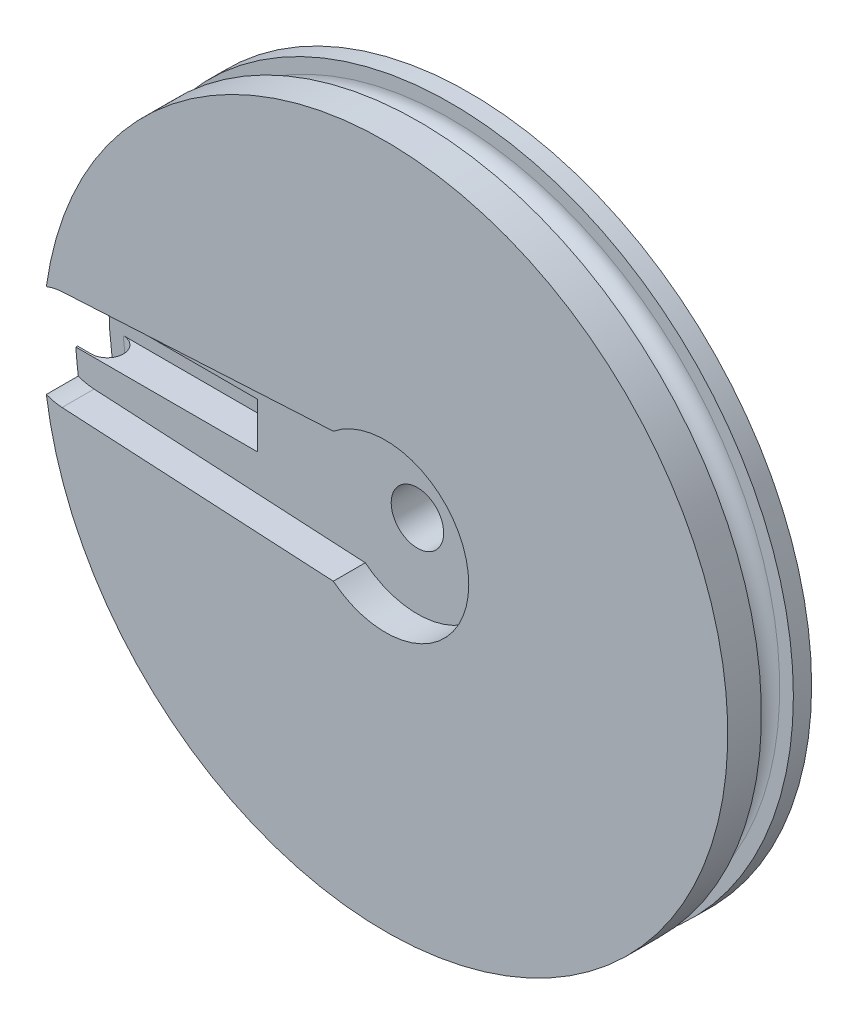
ISO-10303-21;
HEADER;
FILE_DESCRIPTION(('STEP AP214'),'2;1');
FILE_NAME('part.step','',(''),(''),'','','');
FILE_SCHEMA(('AUTOMOTIVE_DESIGN { 1 0 10303 214 1 1 1 1 }'));
ENDSEC;
DATA;
#1=APPLICATION_CONTEXT('core data for automotive mechanical design processes');
#2=APPLICATION_PROTOCOL_DEFINITION('international standard','automotive_design',2000,#1);
#3=PRODUCT_CONTEXT('',#1,'mechanical');
#4=PRODUCT('Part','Part','',(#3));
#5=PRODUCT_RELATED_PRODUCT_CATEGORY('part','',(#4));
#6=PRODUCT_DEFINITION_FORMATION('','',#4);
#7=PRODUCT_DEFINITION_CONTEXT('part definition',#1,'design');
#8=PRODUCT_DEFINITION('design','',#6,#7);
#9=PRODUCT_DEFINITION_SHAPE('','',#8);
#10=(LENGTH_UNIT() NAMED_UNIT(*) SI_UNIT(.MILLI.,.METRE.));
#11=(NAMED_UNIT(*) PLANE_ANGLE_UNIT() SI_UNIT($,.RADIAN.));
#12=(NAMED_UNIT(*) SI_UNIT($,.STERADIAN.) SOLID_ANGLE_UNIT());
#13=UNCERTAINTY_MEASURE_WITH_UNIT(LENGTH_MEASURE(1.E-05),#10,'distance_accuracy_value','');
#14=(GEOMETRIC_REPRESENTATION_CONTEXT(3) GLOBAL_UNCERTAINTY_ASSIGNED_CONTEXT((#13)) GLOBAL_UNIT_ASSIGNED_CONTEXT((#10,
#11,#12)) REPRESENTATION_CONTEXT('',''));
#15=CARTESIAN_POINT('',(0.,0.,0.));
#16=DIRECTION('',(0.,0.,1.));
#17=DIRECTION('',(1.,0.,0.));
#18=AXIS2_PLACEMENT_3D('',#15,#16,#17);
#19=CARTESIAN_POINT('',(0.,0.,1.8375));
#20=DIRECTION('',(0.,0.,-1.));
#21=DIRECTION('',(-1.,0.,0.));
#22=AXIS2_PLACEMENT_3D('',#19,#20,#21);
#23=PLANE('',#22);
#24=DIRECTION('',(0.998510440144325,-0.0545609835210725,0.));
#25=VECTOR('',#24,1.);
#26=CARTESIAN_POINT('',(-14.1700341637464,-2.19672296831752,1.8375));
#27=LINE('',#26,#25);
#28=CARTESIAN_POINT('',(-14.1700341637464,-2.19672296831752,1.8375));
#29=VERTEX_POINT('',#28);
#30=CARTESIAN_POINT('',(-2.28516626205192,-2.84614039618211,1.8375));
#31=VERTEX_POINT('',#30);
#32=EDGE_CURVE('E212',#29,#31,#27,.T.);
#33=ORIENTED_EDGE('',*,*,#32,.F.);
#34=CARTESIAN_POINT('',(-14.05,0.,1.8375));
#35=DIRECTION('',(0.,0.,1.));
#36=DIRECTION('',(1.,0.,0.));
#37=AXIS2_PLACEMENT_3D('',#34,#35,#36);
#38=CIRCLE('',#37,2.2);
#39=CARTESIAN_POINT('',(-14.8598754448399,-2.04550770319876,1.8375));
#40=VERTEX_POINT('',#39);
#41=EDGE_CURVE('E231',#40,#29,#38,.T.);
#42=ORIENTED_EDGE('',*,*,#41,.F.);
#43=CARTESIAN_POINT('',(0.,0.,1.8375));
#44=DIRECTION('',(0.,0.,1.));
#45=DIRECTION('',(1.,0.,0.));
#46=AXIS2_PLACEMENT_3D('',#43,#44,#45);
#47=CIRCLE('',#46,15.);
#48=CARTESIAN_POINT('',(-14.8598754448399,2.04550770319875,1.8375));
#49=VERTEX_POINT('',#48);
#50=EDGE_CURVE('E241',#40,#49,#47,.T.);
#51=ORIENTED_EDGE('',*,*,#50,.T.);
#52=CARTESIAN_POINT('',(-14.1700341637464,2.19672296831751,1.8375));
#53=VERTEX_POINT('',#52);
#54=EDGE_CURVE('E232',#53,#49,#38,.T.);
#55=ORIENTED_EDGE('',*,*,#54,.F.);
#56=DIRECTION('',(-0.998510440144325,-0.0545609835210729,0.));
#57=VECTOR('',#56,1.);
#58=CARTESIAN_POINT('',(-2.28516626205191,2.84614039618211,1.8375));
#59=LINE('',#58,#57);
#60=CARTESIAN_POINT('',(-2.28516626205191,2.84614039618211,1.8375));
#61=VERTEX_POINT('',#60);
#62=EDGE_CURVE('E227',#61,#53,#59,.T.);
#63=ORIENTED_EDGE('',*,*,#62,.F.);
#64=CARTESIAN_POINT('',(0.,0.,1.8375));
#65=DIRECTION('',(0.,0.,1.));
#66=DIRECTION('',(1.,0.,0.));
#67=AXIS2_PLACEMENT_3D('',#64,#65,#66);
#68=CIRCLE('',#67,3.65);
#69=EDGE_CURVE('E223',#31,#61,#68,.T.);
#70=ORIENTED_EDGE('',*,*,#69,.F.);
#71=EDGE_LOOP('',(#33,#42,#51,#55,#63,#70));
#72=FACE_BOUND('',#71,.T.);
#73=ADVANCED_FACE('F45',(#72),#23,.F.);
#74=CARTESIAN_POINT('',(0.,0.,-1.8375));
#75=DIRECTION('',(0.,0.,1.));
#76=DIRECTION('',(1.,0.,0.));
#77=AXIS2_PLACEMENT_3D('',#74,#75,#76);
#78=PLANE('',#77);
#79=CARTESIAN_POINT('',(0.,0.,-1.8375));
#80=DIRECTION('',(0.,0.,-1.));
#81=DIRECTION('',(-1.,0.,0.));
#82=AXIS2_PLACEMENT_3D('',#79,#80,#81);
#83=CIRCLE('',#82,1.15);
#84=CARTESIAN_POINT('',(-1.15,0.,-1.8375));
#85=VERTEX_POINT('',#84);
#86=EDGE_CURVE('E203',#85,#85,#83,.T.);
#87=ORIENTED_EDGE('',*,*,#86,.F.);
#88=EDGE_LOOP('',(#87));
#89=FACE_BOUND('',#88,.T.);
#90=CARTESIAN_POINT('',(0.,0.,-1.8375));
#91=DIRECTION('',(0.,0.,1.));
#92=DIRECTION('',(1.,0.,0.));
#93=AXIS2_PLACEMENT_3D('',#90,#91,#92);
#94=CIRCLE('',#93,15.);
#95=CARTESIAN_POINT('',(15.,0.,-1.8375));
#96=VERTEX_POINT('',#95);
#97=EDGE_CURVE('E268',#96,#96,#94,.T.);
#98=ORIENTED_EDGE('',*,*,#97,.F.);
#99=EDGE_LOOP('',(#98));
#100=FACE_BOUND('',#99,.T.);
#101=ADVANCED_FACE('F339',(#89,#100),#78,.F.);
#102=CARTESIAN_POINT('',(0.,0.,1.8375));
#103=DIRECTION('',(0.,0.,1.));
#104=DIRECTION('',(1.,0.,0.));
#105=AXIS2_PLACEMENT_3D('',#102,#103,#104);
#106=CYLINDRICAL_SURFACE('',#105,15.);
#107=CARTESIAN_POINT('',(0.,0.,-1.0375));
#108=DIRECTION('',(0.,0.,1.));
#109=DIRECTION('',(1.,0.,0.));
#110=AXIS2_PLACEMENT_3D('',#107,#108,#109);
#111=CIRCLE('',#110,15.);
#112=CARTESIAN_POINT('',(15.,0.,-1.0375));
#113=VERTEX_POINT('',#112);
#114=EDGE_CURVE('E264',#113,#113,#111,.T.);
#115=ORIENTED_EDGE('',*,*,#114,.F.);
#116=EDGE_LOOP('',(#115));
#117=FACE_BOUND('',#116,.T.);
#118=ORIENTED_EDGE('',*,*,#97,.T.);
#119=EDGE_LOOP('',(#118));
#120=FACE_BOUND('',#119,.T.);
#121=ADVANCED_FACE('F343',(#117,#120),#106,.T.);
#122=CARTESIAN_POINT('',(0.,14.4,-1.0375));
#123=DIRECTION('',(0.,0.,-1.));
#124=DIRECTION('',(-1.,0.,0.));
#125=AXIS2_PLACEMENT_3D('',#122,#123,#124);
#126=PLANE('',#125);
#127=ORIENTED_EDGE('',*,*,#114,.T.);
#128=EDGE_LOOP('',(#127));
#129=FACE_BOUND('',#128,.T.);
#130=CARTESIAN_POINT('',(0.,0.,-1.0375));
#131=DIRECTION('',(0.,0.,1.));
#132=DIRECTION('',(1.,0.,0.));
#133=AXIS2_PLACEMENT_3D('',#130,#131,#132);
#134=CIRCLE('',#133,14.4);
#135=CARTESIAN_POINT('',(-14.3652358142845,-1.,-1.0375));
#136=VERTEX_POINT('',#135);
#137=CARTESIAN_POINT('',(-14.3652358142845,1.,-1.0375));
#138=VERTEX_POINT('',#137);
#139=EDGE_CURVE('E144',#136,#138,#134,.T.);
#140=ORIENTED_EDGE('',*,*,#139,.F.);
#141=DIRECTION('',(1.,0.,0.));
#142=VECTOR('',#141,1.);
#143=CARTESIAN_POINT('',(0.,-0.999999999999999,-1.0375));
#144=LINE('',#143,#142);
#145=CARTESIAN_POINT('',(-7.,-1.,-1.0375));
#146=VERTEX_POINT('',#145);
#147=EDGE_CURVE('E138',#136,#146,#144,.T.);
#148=ORIENTED_EDGE('',*,*,#147,.T.);
#149=DIRECTION('',(0.,1.,0.));
#150=VECTOR('',#149,1.);
#151=CARTESIAN_POINT('',(-7.,0.,-1.0375));
#152=LINE('',#151,#150);
#153=CARTESIAN_POINT('',(-7.,1.,-1.0375));
#154=VERTEX_POINT('',#153);
#155=EDGE_CURVE('E142',#146,#154,#152,.T.);
#156=ORIENTED_EDGE('',*,*,#155,.T.);
#157=DIRECTION('',(1.,0.,0.));
#158=VECTOR('',#157,1.);
#159=CARTESIAN_POINT('',(0.,1.,-1.0375));
#160=LINE('',#159,#158);
#161=EDGE_CURVE('E304',#138,#154,#160,.T.);
#162=ORIENTED_EDGE('',*,*,#161,.F.);
#163=EDGE_LOOP('',(#140,#148,#156,#162));
#164=FACE_BOUND('',#163,.T.);
#165=ADVANCED_FACE('F140',(#129,#164),#126,.F.);
#166=CARTESIAN_POINT('',(0.,0.,-0.3375));
#167=DIRECTION('',(0.,0.,1.));
#168=DIRECTION('',(1.,0.,0.));
#169=AXIS2_PLACEMENT_3D('',#166,#167,#168);
#170=TOROIDAL_SURFACE('',#169,14.4,0.7);
#171=CARTESIAN_POINT('',(0.,0.,0.3625));
#172=DIRECTION('',(0.,0.,1.));
#173=DIRECTION('',(1.,0.,0.));
#174=AXIS2_PLACEMENT_3D('',#171,#172,#173);
#175=CIRCLE('',#174,14.4);
#176=CARTESIAN_POINT('',(-14.3652358142844,-0.999999999999999,0.3625));
#177=VERTEX_POINT('',#176);
#178=CARTESIAN_POINT('',(-14.3652358142844,1.,0.3625));
#179=VERTEX_POINT('',#178);
#180=EDGE_CURVE('E258',#177,#179,#175,.T.);
#181=ORIENTED_EDGE('',*,*,#180,.F.);
#182=CARTESIAN_POINT('',(-14.1200091201819,-1.,-0.993364992739446));
#183=CARTESIAN_POINT('',(-14.1570332998381,-1.,-1.00713789793754));
#184=CARTESIAN_POINT('',(-14.1952483535872,-1.,-1.01779276078762));
#185=CARTESIAN_POINT('',(-14.2729571345923,-1.,-1.03254400879499));
#186=CARTESIAN_POINT('',(-14.3124523669652,-1.,-1.03663236556032));
#187=CARTESIAN_POINT('',(-14.3915530862235,-1.,-1.03811865648174));
#188=CARTESIAN_POINT('',(-14.4311585101248,-1.,-1.03551984444418));
#189=CARTESIAN_POINT('',(-14.5093598095205,-1.,-1.02370976760342));
#190=CARTESIAN_POINT('',(-14.5479559383791,-1.,-1.01450017914886));
#191=CARTESIAN_POINT('',(-14.6230533181217,-1.,-0.989728339950421));
#192=CARTESIAN_POINT('',(-14.6595545644853,-1.,-0.974166075499242));
#193=CARTESIAN_POINT('',(-14.7294222933319,-1.,-0.937124916265994));
#194=CARTESIAN_POINT('',(-14.7627886684037,-1.,-0.915645818852309));
#195=CARTESIAN_POINT('',(-14.8253829012495,-1.,-0.867413811059375));
#196=CARTESIAN_POINT('',(-14.8546169018491,-1.,-0.840668873110665));
#197=CARTESIAN_POINT('',(-14.908167678575,-1.,-0.782641079569649));
#198=CARTESIAN_POINT('',(-14.9324845216466,-1.,-0.751358285768616));
#199=CARTESIAN_POINT('',(-14.9754542098609,-1.,-0.685215940720889));
#200=CARTESIAN_POINT('',(-14.9941193154848,-1.,-0.650364354534555));
#201=CARTESIAN_POINT('',(-15.0253201343417,-1.,-0.57801782025326));
#202=CARTESIAN_POINT('',(-15.0378559299942,-1.,-0.540522907710229));
#203=CARTESIAN_POINT('',(-15.0564183069841,-1.,-0.464033640717545));
#204=CARTESIAN_POINT('',(-15.062457691401,-1.,-0.425042392970153));
#205=CARTESIAN_POINT('',(-15.0678974439508,-1.,-0.346599566632807));
#206=CARTESIAN_POINT('',(-15.0672978536714,-1.,-0.307147990927986));
#207=CARTESIAN_POINT('',(-15.0594809241225,-1.,-0.228945884440138));
#208=CARTESIAN_POINT('',(-15.0522701657954,-1.,-0.190194695580988));
#209=CARTESIAN_POINT('',(-15.0314474139496,-1.,-0.114452331606176));
#210=CARTESIAN_POINT('',(-15.0178354250184,-1.,-0.0774611552292067));
#211=CARTESIAN_POINT('',(-14.9845945196983,-1.,-0.00627321761232336));
#212=CARTESIAN_POINT('',(-14.9649634618195,-1.,0.0279225435695035));
#213=CARTESIAN_POINT('',(-14.9202475163521,-1.,0.0925396999699259));
#214=CARTESIAN_POINT('',(-14.8951625908144,-1.,0.122961068923296));
#215=CARTESIAN_POINT('',(-14.8402102447582,-1.,0.179218377056796));
#216=CARTESIAN_POINT('',(-14.8103353683984,-1.,0.205047033014688));
#217=CARTESIAN_POINT('',(-14.7466814743682,-1.,0.25133528395664));
#218=CARTESIAN_POINT('',(-14.7129024120517,-1.,0.271794817533678));
#219=CARTESIAN_POINT('',(-14.6423197794805,-1.,0.306811646789875));
#220=CARTESIAN_POINT('',(-14.6055097397008,-1.,0.321355902068445));
#221=CARTESIAN_POINT('',(-14.5299731988057,-1.,0.344071624600201));
#222=CARTESIAN_POINT('',(-14.4912466751208,-1.,0.352243016783946));
#223=CARTESIAN_POINT('',(-14.4128960787855,-1.,0.361995239128481));
#224=CARTESIAN_POINT('',(-14.3732704118788,-1.,0.363563263810453));
#225=CARTESIAN_POINT('',(-14.2943173175714,-1.,0.36003057537363));
#226=CARTESIAN_POINT('',(-14.2549898922119,-1.,0.354929816652714));
#227=CARTESIAN_POINT('',(-14.17771575579,-1.,0.338195713272597));
#228=CARTESIAN_POINT('',(-14.1397702207371,-1.,0.326556936889779));
#229=CARTESIAN_POINT('',(-14.0663736957698,-1.,0.297069561524555));
#230=CARTESIAN_POINT('',(-14.0309227032233,-1.,0.279220969094688));
#231=CARTESIAN_POINT('',(-13.9635516644342,-1.,0.237831335577035));
#232=CARTESIAN_POINT('',(-13.9316290426362,-1.,0.214294487195924));
#233=CARTESIAN_POINT('',(-13.8721988157878,-1.,0.162185229956259));
#234=CARTESIAN_POINT('',(-13.844691161722,-1.,0.133612877009712));
#235=CARTESIAN_POINT('',(-13.7949343163203,-1.,0.072306282863691));
#236=CARTESIAN_POINT('',(-13.772674284804,-1.,0.039580839972388));
#237=CARTESIAN_POINT('',(-13.7339805612442,-1.,-0.0291502893191043));
#238=CARTESIAN_POINT('',(-13.7175467958601,-1.,-0.0651559344211625));
#239=CARTESIAN_POINT('',(-13.6910149327129,-1.,-0.139327650810692));
#240=CARTESIAN_POINT('',(-13.6809009391643,-1.,-0.177488036339599));
#241=CARTESIAN_POINT('',(-13.6672356600389,-1.,-0.254966301390541));
#242=CARTESIAN_POINT('',(-13.6636843116299,-1.,-0.294284169826904));
#243=CARTESIAN_POINT('',(-13.6632474407345,-1.,-0.372888525247103));
#244=CARTESIAN_POINT('',(-13.6663503864826,-1.,-0.412174948680899));
#245=CARTESIAN_POINT('',(-13.6791087428669,-1.,-0.489667252975766));
#246=CARTESIAN_POINT('',(-13.6887638742583,-1.,-0.527873179813786));
#247=CARTESIAN_POINT('',(-13.7143450512518,-1.,-0.602115277876129));
#248=CARTESIAN_POINT('',(-13.7302698271145,-1.,-0.638151886731923));
#249=CARTESIAN_POINT('',(-13.7679390503395,-1.,-0.707055448694299));
#250=CARTESIAN_POINT('',(-13.7896849824346,-1.,-0.739921590234279));
#251=CARTESIAN_POINT('',(-13.8384193247584,-1.,-0.801611358527847));
#252=CARTESIAN_POINT('',(-13.8654185313477,-1.,-0.830426445943844));
#253=CARTESIAN_POINT('',(-13.9238417758102,-1.,-0.883100107230266));
#254=CARTESIAN_POINT('',(-13.955260521011,-1.,-0.906964526448828));
#255=CARTESIAN_POINT('',(-14.0091414322734,-1.,-0.941176342278444));
#256=CARTESIAN_POINT('',(-14.0305377968548,-1.,-0.953234808893276));
#257=CARTESIAN_POINT('',(-14.0744726508358,-1.,-0.975051539135388));
#258=CARTESIAN_POINT('',(-14.0970111414451,-1.,-0.984809800326518));
#259=CARTESIAN_POINT('',(-14.1200091201819,-1.,-0.993364992739446));
#260=B_SPLINE_CURVE_WITH_KNOTS('',3,(#182,#183,#184,#185,#186,#187,#188,#189,#190,#191,#192,
#193,#194,#195,#196,#197,#198,#199,#200,#201,#202,#203,#204,#205,#206,#207,#208,#209,#210,#211,
#212,#213,#214,#215,#216,#217,#218,#219,#220,#221,#222,#223,#224,#225,#226,#227,#228,#229,#230,
#231,#232,#233,#234,#235,#236,#237,#238,#239,#240,#241,#242,#243,#244,#245,#246,#247,#248,#249,
#250,#251,#252,#253,#254,#255,#256,#257,#258,#259),.UNSPECIFIED.,.T.,.F.,(4,2,2,2,2,2,2,2,2,2,2,
2,2,2,2,2,2,2,2,2,2,2,2,2,2,2,2,2,2,2,2,2,2,2,2,2,2,2,4),(0.,0.118419223152216,
0.236983119012334,0.355489335604796,0.473965512217884,0.592441944470845,0.710922434647383,
0.829224907058222,0.947525768714006,1.06556812724181,1.18360889843887,1.30141660711319,
1.41922357781718,1.53691340732293,1.65460315248533,1.77233481848599,1.89006730371133,
2.00798485811155,2.1259037610842,2.24408122868233,2.36226008833648,2.48066801929369,
2.59907675994595,2.71758401926554,2.83609115353779,2.95451120341318,3.07292993848777,
3.19110186563511,3.30927230518956,3.42714430767923,3.54501518162904,3.66268195267949,
3.7803437092543,3.89798164901038,4.0156496219056,4.13356202643768,4.25133440704462,
4.32489173949676,4.39844914985323),.UNSPECIFIED.);
#261=EDGE_CURVE('E197',#177,#136,#260,.T.);
#262=ORIENTED_EDGE('',*,*,#261,.T.);
#263=ORIENTED_EDGE('',*,*,#139,.T.);
#264=CARTESIAN_POINT('',(-14.1200091201819,1.,-0.993364992739446));
#265=CARTESIAN_POINT('',(-14.1570332998381,1.,-1.00713789793754));
#266=CARTESIAN_POINT('',(-14.1952483535872,1.,-1.01779276078762));
#267=CARTESIAN_POINT('',(-14.2729571345923,1.,-1.03254400879499));
#268=CARTESIAN_POINT('',(-14.3124523669652,1.,-1.03663236556032));
#269=CARTESIAN_POINT('',(-14.3915530862235,1.,-1.03811865648174));
#270=CARTESIAN_POINT('',(-14.4311585101248,1.,-1.03551984444418));
#271=CARTESIAN_POINT('',(-14.5093598095205,1.,-1.02370976760342));
#272=CARTESIAN_POINT('',(-14.5479559383791,1.,-1.01450017914886));
#273=CARTESIAN_POINT('',(-14.6230533181217,1.,-0.989728339950421));
#274=CARTESIAN_POINT('',(-14.6595545644853,1.,-0.974166075499242));
#275=CARTESIAN_POINT('',(-14.7294222933319,1.,-0.937124916265994));
#276=CARTESIAN_POINT('',(-14.7627886684037,1.,-0.915645818852309));
#277=CARTESIAN_POINT('',(-14.8253829012495,1.,-0.867413811059375));
#278=CARTESIAN_POINT('',(-14.8546169018491,1.,-0.840668873110665));
#279=CARTESIAN_POINT('',(-14.908167678575,1.,-0.782641079569649));
#280=CARTESIAN_POINT('',(-14.9324845216466,1.,-0.751358285768616));
#281=CARTESIAN_POINT('',(-14.9754542098609,1.,-0.685215940720889));
#282=CARTESIAN_POINT('',(-14.9941193154848,1.,-0.650364354534554));
#283=CARTESIAN_POINT('',(-15.0253201343417,1.,-0.57801782025326));
#284=CARTESIAN_POINT('',(-15.0378559299942,1.,-0.540522907710229));
#285=CARTESIAN_POINT('',(-15.0564183069841,1.,-0.464033640717545));
#286=CARTESIAN_POINT('',(-15.062457691401,1.,-0.425042392970153));
#287=CARTESIAN_POINT('',(-15.0678974439508,1.,-0.346599566632807));
#288=CARTESIAN_POINT('',(-15.0672978536714,1.,-0.307147990927985));
#289=CARTESIAN_POINT('',(-15.0594809241225,1.,-0.228945884440138));
#290=CARTESIAN_POINT('',(-15.0522701657954,1.,-0.190194695580988));
#291=CARTESIAN_POINT('',(-15.0314474139496,1.,-0.114452331606176));
#292=CARTESIAN_POINT('',(-15.0178354250184,1.,-0.0774611552292066));
#293=CARTESIAN_POINT('',(-14.9845945196983,1.,-0.00627321761232314));
#294=CARTESIAN_POINT('',(-14.9649634618195,1.,0.027922543569504));
#295=CARTESIAN_POINT('',(-14.9202475163521,1.,0.0925396999699262));
#296=CARTESIAN_POINT('',(-14.8951625908144,1.,0.122961068923296));
#297=CARTESIAN_POINT('',(-14.8402102447582,1.,0.179218377056796));
#298=CARTESIAN_POINT('',(-14.8103353683984,1.,0.205047033014688));
#299=CARTESIAN_POINT('',(-14.7466814743682,1.,0.251335283956641));
#300=CARTESIAN_POINT('',(-14.7129024120517,1.,0.271794817533678));
#301=CARTESIAN_POINT('',(-14.6423197794805,1.,0.306811646789876));
#302=CARTESIAN_POINT('',(-14.6055097397008,1.,0.321355902068446));
#303=CARTESIAN_POINT('',(-14.5299731988057,1.,0.344071624600201));
#304=CARTESIAN_POINT('',(-14.4912466751208,1.,0.352243016783946));
#305=CARTESIAN_POINT('',(-14.4128960787855,1.,0.361995239128481));
#306=CARTESIAN_POINT('',(-14.3732704118788,1.,0.363563263810454));
#307=CARTESIAN_POINT('',(-14.2943173175714,1.,0.36003057537363));
#308=CARTESIAN_POINT('',(-14.2549898922119,1.,0.354929816652713));
#309=CARTESIAN_POINT('',(-14.17771575579,1.,0.338195713272597));
#310=CARTESIAN_POINT('',(-14.1397702207371,1.,0.326556936889779));
#311=CARTESIAN_POINT('',(-14.0663736957698,1.,0.297069561524555));
#312=CARTESIAN_POINT('',(-14.0309227032233,1.,0.279220969094688));
#313=CARTESIAN_POINT('',(-13.9635516644342,1.,0.237831335577035));
#314=CARTESIAN_POINT('',(-13.9316290426362,1.,0.214294487195924));
#315=CARTESIAN_POINT('',(-13.8721988157878,1.,0.162185229956259));
#316=CARTESIAN_POINT('',(-13.844691161722,1.,0.133612877009711));
#317=CARTESIAN_POINT('',(-13.7949343163203,1.,0.072306282863691));
#318=CARTESIAN_POINT('',(-13.772674284804,1.,0.0395808399723884));
#319=CARTESIAN_POINT('',(-13.7339805612442,1.,-0.0291502893191039));
#320=CARTESIAN_POINT('',(-13.7175467958601,1.,-0.0651559344211625));
#321=CARTESIAN_POINT('',(-13.6910149327129,1.,-0.139327650810692));
#322=CARTESIAN_POINT('',(-13.6809009391643,1.,-0.177488036339599));
#323=CARTESIAN_POINT('',(-13.6672356600389,1.,-0.254966301390541));
#324=CARTESIAN_POINT('',(-13.6636843116299,1.,-0.294284169826904));
#325=CARTESIAN_POINT('',(-13.6632474407345,1.,-0.372888525247103));
#326=CARTESIAN_POINT('',(-13.6663503864826,1.,-0.412174948680899));
#327=CARTESIAN_POINT('',(-13.6791087428669,1.,-0.489667252975766));
#328=CARTESIAN_POINT('',(-13.6887638742583,1.,-0.527873179813785));
#329=CARTESIAN_POINT('',(-13.7143450512518,1.,-0.602115277876129));
#330=CARTESIAN_POINT('',(-13.7302698271145,1.,-0.638151886731923));
#331=CARTESIAN_POINT('',(-13.7679390503395,1.,-0.707055448694298));
#332=CARTESIAN_POINT('',(-13.7896849824346,1.,-0.739921590234279));
#333=CARTESIAN_POINT('',(-13.8384193247584,1.,-0.801611358527847));
#334=CARTESIAN_POINT('',(-13.8654185313477,1.,-0.830426445943843));
#335=CARTESIAN_POINT('',(-13.9238417758102,1.,-0.883100107230266));
#336=CARTESIAN_POINT('',(-13.955260521011,1.,-0.906964526448828));
#337=CARTESIAN_POINT('',(-14.0091414322734,1.,-0.941176342278443));
#338=CARTESIAN_POINT('',(-14.0305377968548,1.,-0.953234808893274));
#339=CARTESIAN_POINT('',(-14.0744726508358,1.,-0.975051539135387));
#340=CARTESIAN_POINT('',(-14.0970111414451,1.,-0.984809800326517));
#341=CARTESIAN_POINT('',(-14.1200091201819,1.,-0.993364992739446));
#342=B_SPLINE_CURVE_WITH_KNOTS('',3,(#264,#265,#266,#267,#268,#269,#270,#271,#272,#273,#274,
#275,#276,#277,#278,#279,#280,#281,#282,#283,#284,#285,#286,#287,#288,#289,#290,#291,#292,#293,
#294,#295,#296,#297,#298,#299,#300,#301,#302,#303,#304,#305,#306,#307,#308,#309,#310,#311,#312,
#313,#314,#315,#316,#317,#318,#319,#320,#321,#322,#323,#324,#325,#326,#327,#328,#329,#330,#331,
#332,#333,#334,#335,#336,#337,#338,#339,#340,#341),.UNSPECIFIED.,.T.,.F.,(4,2,2,2,2,2,2,2,2,2,2,
2,2,2,2,2,2,2,2,2,2,2,2,2,2,2,2,2,2,2,2,2,2,2,2,2,2,2,4),(0.,0.118419223152216,
0.236983119012334,0.355489335604796,0.473965512217884,0.592441944470845,0.710922434647383,
0.829224907058222,0.947525768714006,1.06556812724181,1.18360889843887,1.30141660711319,
1.41922357781719,1.53691340732293,1.65460315248534,1.77233481848599,1.89006730371133,
2.00798485811155,2.1259037610842,2.24408122868233,2.36226008833648,2.48066801929369,
2.59907675994595,2.71758401926554,2.83609115353779,2.95451120341318,3.07292993848777,
3.19110186563511,3.30927230518956,3.42714430767923,3.54501518162904,3.66268195267949,
3.7803437092543,3.89798164901038,4.0156496219056,4.13356202643768,4.25133440704462,
4.32489173949676,4.39844914985323),.UNSPECIFIED.);
#343=EDGE_CURVE('E171',#179,#138,#342,.T.);
#344=ORIENTED_EDGE('',*,*,#343,.F.);
#345=EDGE_LOOP('',(#181,#262,#263,#344));
#346=FACE_BOUND('',#345,.T.);
#347=ADVANCED_FACE('F181',(#346),#170,.F.);
#348=CARTESIAN_POINT('',(0.,15.,0.3625));
#349=DIRECTION('',(0.,0.,1.));
#350=DIRECTION('',(1.,0.,0.));
#351=AXIS2_PLACEMENT_3D('',#348,#349,#350);
#352=PLANE('',#351);
#353=CARTESIAN_POINT('',(0.,0.,0.3625));
#354=DIRECTION('',(0.,0.,1.));
#355=DIRECTION('',(1.,0.,0.));
#356=AXIS2_PLACEMENT_3D('',#353,#354,#355);
#357=CIRCLE('',#356,15.);
#358=CARTESIAN_POINT('',(-14.9666295470958,-1.,0.362499999999996));
#359=VERTEX_POINT('',#358);
#360=CARTESIAN_POINT('',(-14.9666295470958,1.,0.362499999999996));
#361=VERTEX_POINT('',#360);
#362=EDGE_CURVE('E254',#359,#361,#357,.T.);
#363=ORIENTED_EDGE('',*,*,#362,.F.);
#364=DIRECTION('',(1.,0.,0.));
#365=VECTOR('',#364,1.);
#366=CARTESIAN_POINT('',(0.,-0.999999999999997,0.3625));
#367=LINE('',#366,#365);
#368=EDGE_CURVE('E179',#359,#177,#367,.T.);
#369=ORIENTED_EDGE('',*,*,#368,.T.);
#370=ORIENTED_EDGE('',*,*,#180,.T.);
#371=DIRECTION('',(1.,0.,0.));
#372=VECTOR('',#371,1.);
#373=CARTESIAN_POINT('',(0.,1.,0.3625));
#374=LINE('',#373,#372);
#375=EDGE_CURVE('E167',#361,#179,#374,.T.);
#376=ORIENTED_EDGE('',*,*,#375,.F.);
#377=EDGE_LOOP('',(#363,#369,#370,#376));
#378=FACE_BOUND('',#377,.T.);
#379=ADVANCED_FACE('F359',(#378),#352,.F.);
#380=CARTESIAN_POINT('',(0.,0.,1.8375));
#381=DIRECTION('',(0.,0.,1.));
#382=DIRECTION('',(1.,0.,0.));
#383=AXIS2_PLACEMENT_3D('',#380,#381,#382);
#384=CYLINDRICAL_SURFACE('',#383,15.);
#385=CARTESIAN_POINT('',(0.,0.,0.4375));
#386=DIRECTION('',(0.,0.,1.));
#387=DIRECTION('',(1.,0.,0.));
#388=AXIS2_PLACEMENT_3D('',#385,#386,#387);
#389=CIRCLE('',#388,15.);
#390=CARTESIAN_POINT('',(-14.9666295470958,-1.,0.4375));
#391=VERTEX_POINT('',#390);
#392=CARTESIAN_POINT('',(-14.8598754448399,-2.04550770319876,0.4375));
#393=VERTEX_POINT('',#392);
#394=EDGE_CURVE('E272',#391,#393,#389,.T.);
#395=ORIENTED_EDGE('',*,*,#394,.F.);
#396=DIRECTION('',(0.,0.,1.));
#397=VECTOR('',#396,1.);
#398=CARTESIAN_POINT('',(-14.9666295470958,-1.,-9.28371125123532));
#399=LINE('',#398,#397);
#400=EDGE_CURVE('E164',#359,#391,#399,.T.);
#401=ORIENTED_EDGE('',*,*,#400,.F.);
#402=ORIENTED_EDGE('',*,*,#362,.T.);
#403=DIRECTION('',(0.,0.,1.));
#404=VECTOR('',#403,1.);
#405=CARTESIAN_POINT('',(-14.9666295470958,1.,-9.28371125123532));
#406=LINE('',#405,#404);
#407=CARTESIAN_POINT('',(-14.9666295470958,1.,0.4375));
#408=VERTEX_POINT('',#407);
#409=EDGE_CURVE('E301',#361,#408,#406,.T.);
#410=ORIENTED_EDGE('',*,*,#409,.T.);
#411=CARTESIAN_POINT('',(-14.8598754448399,2.04550770319875,0.4375));
#412=VERTEX_POINT('',#411);
#413=EDGE_CURVE('E273',#412,#408,#389,.T.);
#414=ORIENTED_EDGE('',*,*,#413,.F.);
#415=DIRECTION('',(0.,0.,1.));
#416=VECTOR('',#415,1.);
#417=CARTESIAN_POINT('',(-14.8598754448399,2.04550770319875,1.1375));
#418=LINE('',#417,#416);
#419=EDGE_CURVE('E54',#412,#49,#418,.T.);
#420=ORIENTED_EDGE('',*,*,#419,.T.);
#421=ORIENTED_EDGE('',*,*,#50,.F.);
#422=DIRECTION('',(0.,0.,1.));
#423=VECTOR('',#422,1.);
#424=CARTESIAN_POINT('',(-14.8598754448399,-2.04550770319876,1.1375));
#425=LINE('',#424,#423);
#426=EDGE_CURVE('E11',#40,#393,#425,.F.);
#427=ORIENTED_EDGE('',*,*,#426,.T.);
#428=EDGE_LOOP('',(#395,#401,#402,#410,#414,#420,#421,#427));
#429=FACE_BOUND('',#428,.T.);
#430=ADVANCED_FACE('F282',(#429),#384,.T.);
#431=CARTESIAN_POINT('',(-14.05,0.,0.4375));
#432=DIRECTION('',(0.,0.,1.));
#433=DIRECTION('',(1.,0.,0.));
#434=AXIS2_PLACEMENT_3D('',#431,#432,#433);
#435=CYLINDRICAL_SURFACE('',#434,2.2);
#436=ORIENTED_EDGE('',*,*,#41,.T.);
#437=DIRECTION('',(0.,0.,1.));
#438=VECTOR('',#437,1.);
#439=CARTESIAN_POINT('',(-14.1700341637464,-2.19672296831752,0.4375));
#440=LINE('',#439,#438);
#441=CARTESIAN_POINT('',(-14.1700341637464,-2.19672296831752,0.4375));
#442=VERTEX_POINT('',#441);
#443=EDGE_CURVE('E242',#442,#29,#440,.T.);
#444=ORIENTED_EDGE('',*,*,#443,.F.);
#445=CARTESIAN_POINT('',(-14.05,0.,0.4375));
#446=DIRECTION('',(0.,0.,1.));
#447=DIRECTION('',(1.,0.,0.));
#448=AXIS2_PLACEMENT_3D('',#445,#446,#447);
#449=CIRCLE('',#448,2.2);
#450=EDGE_CURVE('E215',#393,#442,#449,.T.);
#451=ORIENTED_EDGE('',*,*,#450,.F.);
#452=ORIENTED_EDGE('',*,*,#426,.F.);
#453=EDGE_LOOP('',(#436,#444,#451,#452));
#454=FACE_BOUND('',#453,.T.);
#455=ADVANCED_FACE('F319',(#454),#435,.F.);
#456=CARTESIAN_POINT('',(-14.1700341637464,2.19672296831751,0.4375));
#457=VERTEX_POINT('',#456);
#458=EDGE_CURVE('E69',#457,#412,#449,.T.);
#459=ORIENTED_EDGE('',*,*,#458,.F.);
#460=DIRECTION('',(0.,0.,1.));
#461=VECTOR('',#460,1.);
#462=CARTESIAN_POINT('',(-14.1700341637464,2.19672296831751,0.4375));
#463=LINE('',#462,#461);
#464=EDGE_CURVE('E246',#457,#53,#463,.T.);
#465=ORIENTED_EDGE('',*,*,#464,.T.);
#466=ORIENTED_EDGE('',*,*,#54,.T.);
#467=ORIENTED_EDGE('',*,*,#419,.F.);
#468=EDGE_LOOP('',(#459,#465,#466,#467));
#469=FACE_BOUND('',#468,.T.);
#470=ADVANCED_FACE('F328',(#469),#435,.F.);
#471=CARTESIAN_POINT('',(0.,0.,0.4375));
#472=DIRECTION('',(0.,0.,1.));
#473=DIRECTION('',(1.,0.,0.));
#474=AXIS2_PLACEMENT_3D('',#471,#472,#473);
#475=PLANE('',#474);
#476=DIRECTION('',(1.,0.,0.));
#477=VECTOR('',#476,1.);
#478=CARTESIAN_POINT('',(0.,-0.999999999999999,0.4375));
#479=LINE('',#478,#477);
#480=CARTESIAN_POINT('',(-7.,-1.,0.4375));
#481=VERTEX_POINT('',#480);
#482=EDGE_CURVE('E158',#391,#481,#479,.T.);
#483=ORIENTED_EDGE('',*,*,#482,.F.);
#484=ORIENTED_EDGE('',*,*,#394,.T.);
#485=ORIENTED_EDGE('',*,*,#450,.T.);
#486=DIRECTION('',(0.998510440144325,-0.0545609835210725,0.));
#487=VECTOR('',#486,1.);
#488=CARTESIAN_POINT('',(-14.1700341637464,-2.19672296831752,0.4375));
#489=LINE('',#488,#487);
#490=CARTESIAN_POINT('',(-2.28516626205192,-2.84614039618211,0.4375));
#491=VERTEX_POINT('',#490);
#492=EDGE_CURVE('E218',#442,#491,#489,.T.);
#493=ORIENTED_EDGE('',*,*,#492,.T.);
#494=CARTESIAN_POINT('',(0.,0.,0.4375));
#495=DIRECTION('',(0.,0.,1.));
#496=DIRECTION('',(1.,0.,0.));
#497=AXIS2_PLACEMENT_3D('',#494,#495,#496);
#498=CIRCLE('',#497,3.65);
#499=CARTESIAN_POINT('',(-2.28516626205191,2.84614039618211,0.4375));
#500=VERTEX_POINT('',#499);
#501=EDGE_CURVE('E207',#491,#500,#498,.T.);
#502=ORIENTED_EDGE('',*,*,#501,.T.);
#503=DIRECTION('',(-0.998510440144325,-0.0545609835210729,0.));
#504=VECTOR('',#503,1.);
#505=CARTESIAN_POINT('',(-2.28516626205191,2.84614039618211,0.4375));
#506=LINE('',#505,#504);
#507=EDGE_CURVE('E211',#500,#457,#506,.T.);
#508=ORIENTED_EDGE('',*,*,#507,.T.);
#509=ORIENTED_EDGE('',*,*,#458,.T.);
#510=ORIENTED_EDGE('',*,*,#413,.T.);
#511=DIRECTION('',(1.,0.,0.));
#512=VECTOR('',#511,1.);
#513=CARTESIAN_POINT('',(0.,1.,0.4375));
#514=LINE('',#513,#512);
#515=CARTESIAN_POINT('',(-7.,1.,0.4375));
#516=VERTEX_POINT('',#515);
#517=EDGE_CURVE('E168',#408,#516,#514,.T.);
#518=ORIENTED_EDGE('',*,*,#517,.T.);
#519=DIRECTION('',(0.,1.,0.));
#520=VECTOR('',#519,1.);
#521=CARTESIAN_POINT('',(-7.,0.,0.4375));
#522=LINE('',#521,#520);
#523=EDGE_CURVE('E61',#481,#516,#522,.T.);
#524=ORIENTED_EDGE('',*,*,#523,.F.);
#525=EDGE_LOOP('',(#483,#484,#485,#493,#502,#508,#509,#510,#518,#524));
#526=FACE_BOUND('',#525,.T.);
#527=CARTESIAN_POINT('',(0.,0.,0.4375));
#528=DIRECTION('',(0.,0.,1.));
#529=DIRECTION('',(1.,0.,0.));
#530=AXIS2_PLACEMENT_3D('',#527,#528,#529);
#531=CIRCLE('',#530,1.15);
#532=CARTESIAN_POINT('',(1.15,0.,0.4375));
#533=VERTEX_POINT('',#532);
#534=EDGE_CURVE('E48',#533,#533,#531,.T.);
#535=ORIENTED_EDGE('',*,*,#534,.F.);
#536=EDGE_LOOP('',(#535));
#537=FACE_BOUND('',#536,.T.);
#538=ADVANCED_FACE('F305',(#526,#537),#475,.T.);
#539=CARTESIAN_POINT('',(0.,0.,0.4375));
#540=DIRECTION('',(0.,0.,1.));
#541=DIRECTION('',(1.,0.,0.));
#542=AXIS2_PLACEMENT_3D('',#539,#540,#541);
#543=CYLINDRICAL_SURFACE('',#542,3.65);
#544=ORIENTED_EDGE('',*,*,#69,.T.);
#545=DIRECTION('',(0.,0.,1.));
#546=VECTOR('',#545,1.);
#547=CARTESIAN_POINT('',(-2.28516626205191,2.84614039618211,0.4375));
#548=LINE('',#547,#546);
#549=EDGE_CURVE('E222',#500,#61,#548,.T.);
#550=ORIENTED_EDGE('',*,*,#549,.F.);
#551=ORIENTED_EDGE('',*,*,#501,.F.);
#552=DIRECTION('',(0.,0.,1.));
#553=VECTOR('',#552,1.);
#554=CARTESIAN_POINT('',(-2.28516626205192,-2.84614039618211,0.4375));
#555=LINE('',#554,#553);
#556=EDGE_CURVE('E238',#491,#31,#555,.T.);
#557=ORIENTED_EDGE('',*,*,#556,.T.);
#558=EDGE_LOOP('',(#544,#550,#551,#557));
#559=FACE_BOUND('',#558,.T.);
#560=ADVANCED_FACE('F324',(#559),#543,.F.);
#561=CARTESIAN_POINT('',(-14.1700341637464,-2.19672296831752,0.4375));
#562=DIRECTION('',(-0.0545609835210725,-0.998510440144325,0.));
#563=DIRECTION('',(0.998510440144325,-0.0545609835210725,0.));
#564=AXIS2_PLACEMENT_3D('',#561,#562,#563);
#565=PLANE('',#564);
#566=ORIENTED_EDGE('',*,*,#32,.T.);
#567=ORIENTED_EDGE('',*,*,#556,.F.);
#568=ORIENTED_EDGE('',*,*,#492,.F.);
#569=ORIENTED_EDGE('',*,*,#443,.T.);
#570=EDGE_LOOP('',(#566,#567,#568,#569));
#571=FACE_BOUND('',#570,.T.);
#572=ADVANCED_FACE('F321',(#571),#565,.F.);
#573=CARTESIAN_POINT('',(-2.28516626205191,2.84614039618211,0.4375));
#574=DIRECTION('',(-0.0545609835210729,0.998510440144325,0.));
#575=DIRECTION('',(-0.998510440144325,-0.0545609835210729,0.));
#576=AXIS2_PLACEMENT_3D('',#573,#574,#575);
#577=PLANE('',#576);
#578=ORIENTED_EDGE('',*,*,#62,.T.);
#579=ORIENTED_EDGE('',*,*,#464,.F.);
#580=ORIENTED_EDGE('',*,*,#507,.F.);
#581=ORIENTED_EDGE('',*,*,#549,.T.);
#582=EDGE_LOOP('',(#578,#579,#580,#581));
#583=FACE_BOUND('',#582,.T.);
#584=ADVANCED_FACE('F327',(#583),#577,.F.);
#585=CARTESIAN_POINT('',(0.,0.,1.8375));
#586=DIRECTION('',(0.,0.,-1.));
#587=DIRECTION('',(-1.,0.,0.));
#588=AXIS2_PLACEMENT_3D('',#585,#586,#587);
#589=CYLINDRICAL_SURFACE('',#588,1.15);
#590=ORIENTED_EDGE('',*,*,#534,.T.);
#591=EDGE_LOOP('',(#590));
#592=FACE_BOUND('',#591,.T.);
#593=ORIENTED_EDGE('',*,*,#86,.T.);
#594=EDGE_LOOP('',(#593));
#595=FACE_BOUND('',#594,.T.);
#596=ADVANCED_FACE('F195',(#592,#595),#589,.F.);
#597=CARTESIAN_POINT('',(0.,-0.999999999999999,-9.28371125123532));
#598=DIRECTION('',(0.,-1.,0.));
#599=DIRECTION('',(1.,0.,0.));
#600=AXIS2_PLACEMENT_3D('',#597,#598,#599);
#601=PLANE('',#600);
#602=ORIENTED_EDGE('',*,*,#368,.F.);
#603=ORIENTED_EDGE('',*,*,#400,.T.);
#604=ORIENTED_EDGE('',*,*,#482,.T.);
#605=DIRECTION('',(0.,0.,1.));
#606=VECTOR('',#605,1.);
#607=CARTESIAN_POINT('',(-7.,-1.,-9.28371125123532));
#608=LINE('',#607,#606);
#609=EDGE_CURVE('E149',#146,#481,#608,.T.);
#610=ORIENTED_EDGE('',*,*,#609,.F.);
#611=ORIENTED_EDGE('',*,*,#147,.F.);
#612=ORIENTED_EDGE('',*,*,#261,.F.);
#613=EDGE_LOOP('',(#602,#603,#604,#610,#611,#612));
#614=FACE_BOUND('',#613,.T.);
#615=ADVANCED_FACE('F156',(#614),#601,.F.);
#616=CARTESIAN_POINT('',(0.,1.,-9.28371125123532));
#617=DIRECTION('',(0.,-1.,0.));
#618=DIRECTION('',(0.,0.,-1.));
#619=AXIS2_PLACEMENT_3D('',#616,#617,#618);
#620=PLANE('',#619);
#621=ORIENTED_EDGE('',*,*,#343,.T.);
#622=ORIENTED_EDGE('',*,*,#161,.T.);
#623=DIRECTION('',(0.,0.,1.));
#624=VECTOR('',#623,1.);
#625=CARTESIAN_POINT('',(-7.,1.,-9.28371125123532));
#626=LINE('',#625,#624);
#627=EDGE_CURVE('E153',#154,#516,#626,.T.);
#628=ORIENTED_EDGE('',*,*,#627,.T.);
#629=ORIENTED_EDGE('',*,*,#517,.F.);
#630=ORIENTED_EDGE('',*,*,#409,.F.);
#631=ORIENTED_EDGE('',*,*,#375,.T.);
#632=EDGE_LOOP('',(#621,#622,#628,#629,#630,#631));
#633=FACE_BOUND('',#632,.T.);
#634=ADVANCED_FACE('F185',(#633),#620,.T.);
#635=CARTESIAN_POINT('',(-7.,0.,-9.28371125123532));
#636=DIRECTION('',(1.,0.,0.));
#637=DIRECTION('',(0.,0.,-1.));
#638=AXIS2_PLACEMENT_3D('',#635,#636,#637);
#639=PLANE('',#638);
#640=ORIENTED_EDGE('',*,*,#609,.T.);
#641=ORIENTED_EDGE('',*,*,#523,.T.);
#642=ORIENTED_EDGE('',*,*,#627,.F.);
#643=ORIENTED_EDGE('',*,*,#155,.F.);
#644=EDGE_LOOP('',(#640,#641,#642,#643));
#645=FACE_BOUND('',#644,.T.);
#646=ADVANCED_FACE('F151',(#645),#639,.F.);
#647=CLOSED_SHELL('',(#73,#101,#121,#165,#347,#379,#430,#455,#470,#538,#560,#572,#584,#596,#615,
#634,#646));
#648=MANIFOLD_SOLID_BREP('B2',#647);
#649=ADVANCED_BREP_SHAPE_REPRESENTATION('',(#18,#648),#14);
#650=SHAPE_DEFINITION_REPRESENTATION(#9,#649);
ENDSEC;
END-ISO-10303-21;
